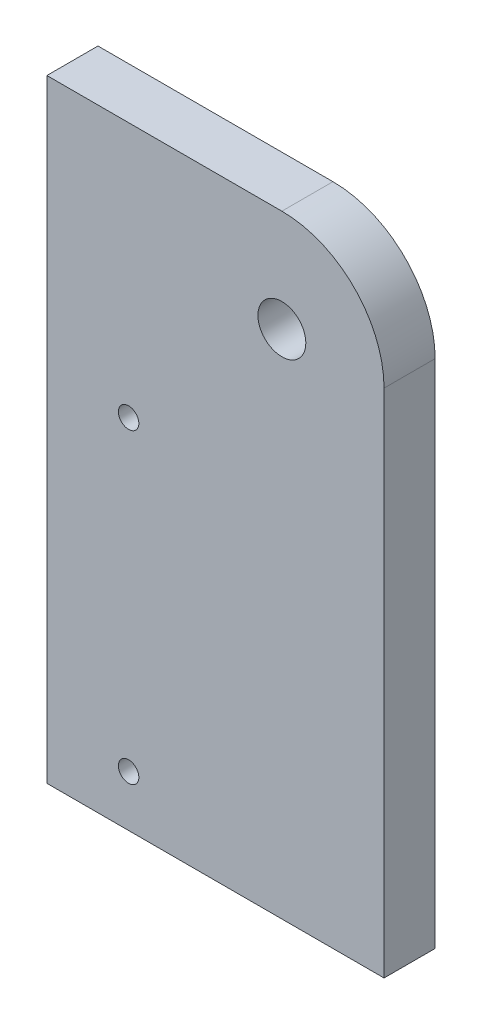
ISO-10303-21;
HEADER;
FILE_DESCRIPTION(('STEP AP214'),'2;1');
FILE_NAME('part.step','',(''),(''),'','','');
FILE_SCHEMA(('AUTOMOTIVE_DESIGN { 1 0 10303 214 1 1 1 1 }'));
ENDSEC;
DATA;
#1=APPLICATION_CONTEXT('core data for automotive mechanical design processes');
#2=APPLICATION_PROTOCOL_DEFINITION('international standard','automotive_design',2000,#1);
#3=PRODUCT_CONTEXT('',#1,'mechanical');
#4=PRODUCT('Part','Part','',(#3));
#5=PRODUCT_RELATED_PRODUCT_CATEGORY('part','',(#4));
#6=PRODUCT_DEFINITION_FORMATION('','',#4);
#7=PRODUCT_DEFINITION_CONTEXT('part definition',#1,'design');
#8=PRODUCT_DEFINITION('design','',#6,#7);
#9=PRODUCT_DEFINITION_SHAPE('','',#8);
#10=(LENGTH_UNIT() NAMED_UNIT(*) SI_UNIT(.MILLI.,.METRE.));
#11=(NAMED_UNIT(*) PLANE_ANGLE_UNIT() SI_UNIT($,.RADIAN.));
#12=(NAMED_UNIT(*) SI_UNIT($,.STERADIAN.) SOLID_ANGLE_UNIT());
#13=UNCERTAINTY_MEASURE_WITH_UNIT(LENGTH_MEASURE(1.E-05),#10,'distance_accuracy_value','');
#14=(GEOMETRIC_REPRESENTATION_CONTEXT(3) GLOBAL_UNCERTAINTY_ASSIGNED_CONTEXT((#13)) GLOBAL_UNIT_ASSIGNED_CONTEXT((#10,
#11,#12)) REPRESENTATION_CONTEXT('',''));
#15=CARTESIAN_POINT('',(0.,0.,0.));
#16=DIRECTION('',(0.,0.,1.));
#17=DIRECTION('',(1.,0.,0.));
#18=AXIS2_PLACEMENT_3D('',#15,#16,#17);
#19=CARTESIAN_POINT('',(23.,50.,5.));
#20=DIRECTION('',(0.,0.,-1.));
#21=DIRECTION('',(-1.,0.,0.));
#22=AXIS2_PLACEMENT_3D('',#19,#20,#21);
#23=CYLINDRICAL_SURFACE('',#22,10.);
#24=CARTESIAN_POINT('',(23.,50.,0.));
#25=DIRECTION('',(0.,0.,1.));
#26=DIRECTION('',(1.,0.,0.));
#27=AXIS2_PLACEMENT_3D('',#24,#25,#26);
#28=CIRCLE('',#27,10.);
#29=CARTESIAN_POINT('',(23.,60.,0.));
#30=VERTEX_POINT('',#29);
#31=CARTESIAN_POINT('',(33.,50.,0.));
#32=VERTEX_POINT('',#31);
#33=EDGE_CURVE('E121',#30,#32,#28,.F.);
#34=ORIENTED_EDGE('',*,*,#33,.F.);
#35=DIRECTION('',(0.,0.,-1.));
#36=VECTOR('',#35,1.);
#37=CARTESIAN_POINT('',(23.,60.,5.));
#38=LINE('',#37,#36);
#39=CARTESIAN_POINT('',(23.,60.,5.));
#40=VERTEX_POINT('',#39);
#41=EDGE_CURVE('E11',#40,#30,#38,.T.);
#42=ORIENTED_EDGE('',*,*,#41,.F.);
#43=CARTESIAN_POINT('',(23.,50.,5.));
#44=DIRECTION('',(0.,0.,1.));
#45=DIRECTION('',(1.,0.,0.));
#46=AXIS2_PLACEMENT_3D('',#43,#44,#45);
#47=CIRCLE('',#46,10.);
#48=CARTESIAN_POINT('',(33.,50.,5.));
#49=VERTEX_POINT('',#48);
#50=EDGE_CURVE('E107',#40,#49,#47,.F.);
#51=ORIENTED_EDGE('',*,*,#50,.T.);
#52=DIRECTION('',(0.,0.,-1.));
#53=VECTOR('',#52,1.);
#54=CARTESIAN_POINT('',(33.,50.,5.));
#55=LINE('',#54,#53);
#56=EDGE_CURVE('E76',#49,#32,#55,.T.);
#57=ORIENTED_EDGE('',*,*,#56,.T.);
#58=EDGE_LOOP('',(#34,#42,#51,#57));
#59=FACE_BOUND('',#58,.T.);
#60=ADVANCED_FACE('F33',(#59),#23,.T.);
#61=CARTESIAN_POINT('',(0.,60.,5.));
#62=DIRECTION('',(0.,1.,0.));
#63=DIRECTION('',(0.,0.,1.));
#64=AXIS2_PLACEMENT_3D('',#61,#62,#63);
#65=PLANE('',#64);
#66=DIRECTION('',(1.,0.,0.));
#67=VECTOR('',#66,1.);
#68=CARTESIAN_POINT('',(0.,60.,0.));
#69=LINE('',#68,#67);
#70=CARTESIAN_POINT('',(0.,60.,0.));
#71=VERTEX_POINT('',#70);
#72=EDGE_CURVE('E123',#71,#30,#69,.T.);
#73=ORIENTED_EDGE('',*,*,#72,.F.);
#74=DIRECTION('',(0.,0.,-1.));
#75=VECTOR('',#74,1.);
#76=CARTESIAN_POINT('',(0.,60.,5.));
#77=LINE('',#76,#75);
#78=CARTESIAN_POINT('',(0.,60.,5.));
#79=VERTEX_POINT('',#78);
#80=EDGE_CURVE('E42',#79,#71,#77,.T.);
#81=ORIENTED_EDGE('',*,*,#80,.F.);
#82=DIRECTION('',(1.,0.,0.));
#83=VECTOR('',#82,1.);
#84=CARTESIAN_POINT('',(0.,60.,5.));
#85=LINE('',#84,#83);
#86=EDGE_CURVE('E105',#79,#40,#85,.T.);
#87=ORIENTED_EDGE('',*,*,#86,.T.);
#88=ORIENTED_EDGE('',*,*,#41,.T.);
#89=EDGE_LOOP('',(#73,#81,#87,#88));
#90=FACE_BOUND('',#89,.T.);
#91=ADVANCED_FACE('F140',(#90),#65,.T.);
#92=CARTESIAN_POINT('',(0.,0.,5.));
#93=DIRECTION('',(-1.,0.,0.));
#94=DIRECTION('',(0.,-1.,0.));
#95=AXIS2_PLACEMENT_3D('',#92,#93,#94);
#96=PLANE('',#95);
#97=DIRECTION('',(0.,1.,0.));
#98=VECTOR('',#97,1.);
#99=CARTESIAN_POINT('',(0.,0.,0.));
#100=LINE('',#99,#98);
#101=CARTESIAN_POINT('',(0.,0.,0.));
#102=VERTEX_POINT('',#101);
#103=EDGE_CURVE('E92',#102,#71,#100,.T.);
#104=ORIENTED_EDGE('',*,*,#103,.F.);
#105=DIRECTION('',(0.,0.,-1.));
#106=VECTOR('',#105,1.);
#107=CARTESIAN_POINT('',(0.,0.,5.));
#108=LINE('',#107,#106);
#109=CARTESIAN_POINT('',(0.,0.,5.));
#110=VERTEX_POINT('',#109);
#111=EDGE_CURVE('E86',#110,#102,#108,.T.);
#112=ORIENTED_EDGE('',*,*,#111,.F.);
#113=DIRECTION('',(0.,1.,0.));
#114=VECTOR('',#113,1.);
#115=CARTESIAN_POINT('',(0.,0.,5.));
#116=LINE('',#115,#114);
#117=EDGE_CURVE('E90',#110,#79,#116,.T.);
#118=ORIENTED_EDGE('',*,*,#117,.T.);
#119=ORIENTED_EDGE('',*,*,#80,.T.);
#120=EDGE_LOOP('',(#104,#112,#118,#119));
#121=FACE_BOUND('',#120,.T.);
#122=ADVANCED_FACE('F88',(#121),#96,.T.);
#123=CARTESIAN_POINT('',(0.,0.,5.));
#124=DIRECTION('',(0.,1.,0.));
#125=DIRECTION('',(0.,0.,1.));
#126=AXIS2_PLACEMENT_3D('',#123,#124,#125);
#127=PLANE('',#126);
#128=DIRECTION('',(1.,0.,0.));
#129=VECTOR('',#128,1.);
#130=CARTESIAN_POINT('',(0.,0.,0.));
#131=LINE('',#130,#129);
#132=CARTESIAN_POINT('',(33.,0.,0.));
#133=VERTEX_POINT('',#132);
#134=EDGE_CURVE('E127',#102,#133,#131,.T.);
#135=ORIENTED_EDGE('',*,*,#134,.T.);
#136=DIRECTION('',(0.,0.,-1.));
#137=VECTOR('',#136,1.);
#138=CARTESIAN_POINT('',(33.,0.,5.));
#139=LINE('',#138,#137);
#140=CARTESIAN_POINT('',(33.,0.,5.));
#141=VERTEX_POINT('',#140);
#142=EDGE_CURVE('E95',#141,#133,#139,.T.);
#143=ORIENTED_EDGE('',*,*,#142,.F.);
#144=DIRECTION('',(1.,0.,0.));
#145=VECTOR('',#144,1.);
#146=CARTESIAN_POINT('',(0.,0.,5.));
#147=LINE('',#146,#145);
#148=EDGE_CURVE('E98',#110,#141,#147,.T.);
#149=ORIENTED_EDGE('',*,*,#148,.F.);
#150=ORIENTED_EDGE('',*,*,#111,.T.);
#151=EDGE_LOOP('',(#135,#143,#149,#150));
#152=FACE_BOUND('',#151,.T.);
#153=ADVANCED_FACE('F99',(#152),#127,.F.);
#154=CARTESIAN_POINT('',(8.,35.,5.));
#155=DIRECTION('',(0.,0.,-1.));
#156=DIRECTION('',(-1.,0.,0.));
#157=AXIS2_PLACEMENT_3D('',#154,#155,#156);
#158=CYLINDRICAL_SURFACE('',#157,1.);
#159=CARTESIAN_POINT('',(8.,35.,5.));
#160=DIRECTION('',(0.,0.,1.));
#161=DIRECTION('',(1.,0.,0.));
#162=AXIS2_PLACEMENT_3D('',#159,#160,#161);
#163=CIRCLE('',#162,1.);
#164=CARTESIAN_POINT('',(9.,35.,5.));
#165=VERTEX_POINT('',#164);
#166=EDGE_CURVE('E112',#165,#165,#163,.T.);
#167=ORIENTED_EDGE('',*,*,#166,.T.);
#168=EDGE_LOOP('',(#167));
#169=FACE_BOUND('',#168,.T.);
#170=CARTESIAN_POINT('',(8.,35.,0.));
#171=DIRECTION('',(0.,0.,1.));
#172=DIRECTION('',(1.,0.,0.));
#173=AXIS2_PLACEMENT_3D('',#170,#171,#172);
#174=CIRCLE('',#173,1.);
#175=CARTESIAN_POINT('',(9.,35.,0.));
#176=VERTEX_POINT('',#175);
#177=EDGE_CURVE('E130',#176,#176,#174,.T.);
#178=ORIENTED_EDGE('',*,*,#177,.F.);
#179=EDGE_LOOP('',(#178));
#180=FACE_BOUND('',#179,.T.);
#181=ADVANCED_FACE('F173',(#169,#180),#158,.F.);
#182=CARTESIAN_POINT('',(33.,0.,5.));
#183=DIRECTION('',(-1.,0.,0.));
#184=DIRECTION('',(0.,-1.,0.));
#185=AXIS2_PLACEMENT_3D('',#182,#183,#184);
#186=PLANE('',#185);
#187=DIRECTION('',(0.,1.,0.));
#188=VECTOR('',#187,1.);
#189=CARTESIAN_POINT('',(33.,0.,0.));
#190=LINE('',#189,#188);
#191=EDGE_CURVE('E69',#133,#32,#190,.T.);
#192=ORIENTED_EDGE('',*,*,#191,.T.);
#193=ORIENTED_EDGE('',*,*,#56,.F.);
#194=DIRECTION('',(0.,1.,0.));
#195=VECTOR('',#194,1.);
#196=CARTESIAN_POINT('',(33.,0.,5.));
#197=LINE('',#196,#195);
#198=EDGE_CURVE('E50',#141,#49,#197,.T.);
#199=ORIENTED_EDGE('',*,*,#198,.F.);
#200=ORIENTED_EDGE('',*,*,#142,.T.);
#201=EDGE_LOOP('',(#192,#193,#199,#200));
#202=FACE_BOUND('',#201,.T.);
#203=ADVANCED_FACE('F160',(#202),#186,.F.);
#204=CARTESIAN_POINT('',(23.,50.,5.));
#205=DIRECTION('',(0.,0.,-1.));
#206=DIRECTION('',(-1.,0.,0.));
#207=AXIS2_PLACEMENT_3D('',#204,#205,#206);
#208=CYLINDRICAL_SURFACE('',#207,2.34375);
#209=CARTESIAN_POINT('',(23.,50.,5.));
#210=DIRECTION('',(0.,0.,1.));
#211=DIRECTION('',(1.,0.,0.));
#212=AXIS2_PLACEMENT_3D('',#209,#210,#211);
#213=CIRCLE('',#212,2.34375);
#214=CARTESIAN_POINT('',(25.34375,50.,5.));
#215=VERTEX_POINT('',#214);
#216=EDGE_CURVE('E136',#215,#215,#213,.T.);
#217=ORIENTED_EDGE('',*,*,#216,.T.);
#218=EDGE_LOOP('',(#217));
#219=FACE_BOUND('',#218,.T.);
#220=CARTESIAN_POINT('',(23.,50.,0.));
#221=DIRECTION('',(0.,0.,1.));
#222=DIRECTION('',(1.,0.,0.));
#223=AXIS2_PLACEMENT_3D('',#220,#221,#222);
#224=CIRCLE('',#223,2.34375);
#225=CARTESIAN_POINT('',(25.34375,50.,0.));
#226=VERTEX_POINT('',#225);
#227=EDGE_CURVE('E118',#226,#226,#224,.T.);
#228=ORIENTED_EDGE('',*,*,#227,.F.);
#229=EDGE_LOOP('',(#228));
#230=FACE_BOUND('',#229,.T.);
#231=ADVANCED_FACE('F35',(#219,#230),#208,.F.);
#232=CARTESIAN_POINT('',(8.,5.,5.));
#233=DIRECTION('',(0.,0.,-1.));
#234=DIRECTION('',(-1.,0.,0.));
#235=AXIS2_PLACEMENT_3D('',#232,#233,#234);
#236=CYLINDRICAL_SURFACE('',#235,1.);
#237=CARTESIAN_POINT('',(8.,5.,5.));
#238=DIRECTION('',(0.,0.,1.));
#239=DIRECTION('',(1.,0.,0.));
#240=AXIS2_PLACEMENT_3D('',#237,#238,#239);
#241=CIRCLE('',#240,1.);
#242=CARTESIAN_POINT('',(9.,5.,5.));
#243=VERTEX_POINT('',#242);
#244=EDGE_CURVE('E115',#243,#243,#241,.T.);
#245=ORIENTED_EDGE('',*,*,#244,.T.);
#246=EDGE_LOOP('',(#245));
#247=FACE_BOUND('',#246,.T.);
#248=CARTESIAN_POINT('',(8.,5.,0.));
#249=DIRECTION('',(0.,0.,1.));
#250=DIRECTION('',(1.,0.,0.));
#251=AXIS2_PLACEMENT_3D('',#248,#249,#250);
#252=CIRCLE('',#251,1.);
#253=CARTESIAN_POINT('',(9.,5.,0.));
#254=VERTEX_POINT('',#253);
#255=EDGE_CURVE('E133',#254,#254,#252,.T.);
#256=ORIENTED_EDGE('',*,*,#255,.F.);
#257=EDGE_LOOP('',(#256));
#258=FACE_BOUND('',#257,.T.);
#259=ADVANCED_FACE('F150',(#247,#258),#236,.F.);
#260=CARTESIAN_POINT('',(0.,0.,5.));
#261=DIRECTION('',(0.,0.,1.));
#262=DIRECTION('',(1.,0.,0.));
#263=AXIS2_PLACEMENT_3D('',#260,#261,#262);
#264=PLANE('',#263);
#265=ORIENTED_EDGE('',*,*,#216,.F.);
#266=EDGE_LOOP('',(#265));
#267=FACE_BOUND('',#266,.T.);
#268=ORIENTED_EDGE('',*,*,#50,.F.);
#269=ORIENTED_EDGE('',*,*,#86,.F.);
#270=ORIENTED_EDGE('',*,*,#117,.F.);
#271=ORIENTED_EDGE('',*,*,#148,.T.);
#272=ORIENTED_EDGE('',*,*,#198,.T.);
#273=EDGE_LOOP('',(#268,#269,#270,#271,#272));
#274=FACE_BOUND('',#273,.T.);
#275=ORIENTED_EDGE('',*,*,#166,.F.);
#276=EDGE_LOOP('',(#275));
#277=FACE_BOUND('',#276,.T.);
#278=ORIENTED_EDGE('',*,*,#244,.F.);
#279=EDGE_LOOP('',(#278));
#280=FACE_BOUND('',#279,.T.);
#281=ADVANCED_FACE('F102',(#267,#274,#277,#280),#264,.T.);
#282=CARTESIAN_POINT('',(0.,0.,0.));
#283=DIRECTION('',(0.,0.,1.));
#284=DIRECTION('',(1.,0.,0.));
#285=AXIS2_PLACEMENT_3D('',#282,#283,#284);
#286=PLANE('',#285);
#287=ORIENTED_EDGE('',*,*,#227,.T.);
#288=EDGE_LOOP('',(#287));
#289=FACE_BOUND('',#288,.T.);
#290=ORIENTED_EDGE('',*,*,#33,.T.);
#291=ORIENTED_EDGE('',*,*,#191,.F.);
#292=ORIENTED_EDGE('',*,*,#134,.F.);
#293=ORIENTED_EDGE('',*,*,#103,.T.);
#294=ORIENTED_EDGE('',*,*,#72,.T.);
#295=EDGE_LOOP('',(#290,#291,#292,#293,#294));
#296=FACE_BOUND('',#295,.T.);
#297=ORIENTED_EDGE('',*,*,#177,.T.);
#298=EDGE_LOOP('',(#297));
#299=FACE_BOUND('',#298,.T.);
#300=ORIENTED_EDGE('',*,*,#255,.T.);
#301=EDGE_LOOP('',(#300));
#302=FACE_BOUND('',#301,.T.);
#303=ADVANCED_FACE('F141',(#289,#296,#299,#302),#286,.F.);
#304=CLOSED_SHELL('',(#60,#91,#122,#153,#181,#203,#231,#259,#281,#303));
#305=MANIFOLD_SOLID_BREP('B2',#304);
#306=ADVANCED_BREP_SHAPE_REPRESENTATION('',(#18,#305),#14);
#307=SHAPE_DEFINITION_REPRESENTATION(#9,#306);
ENDSEC;
END-ISO-10303-21;
